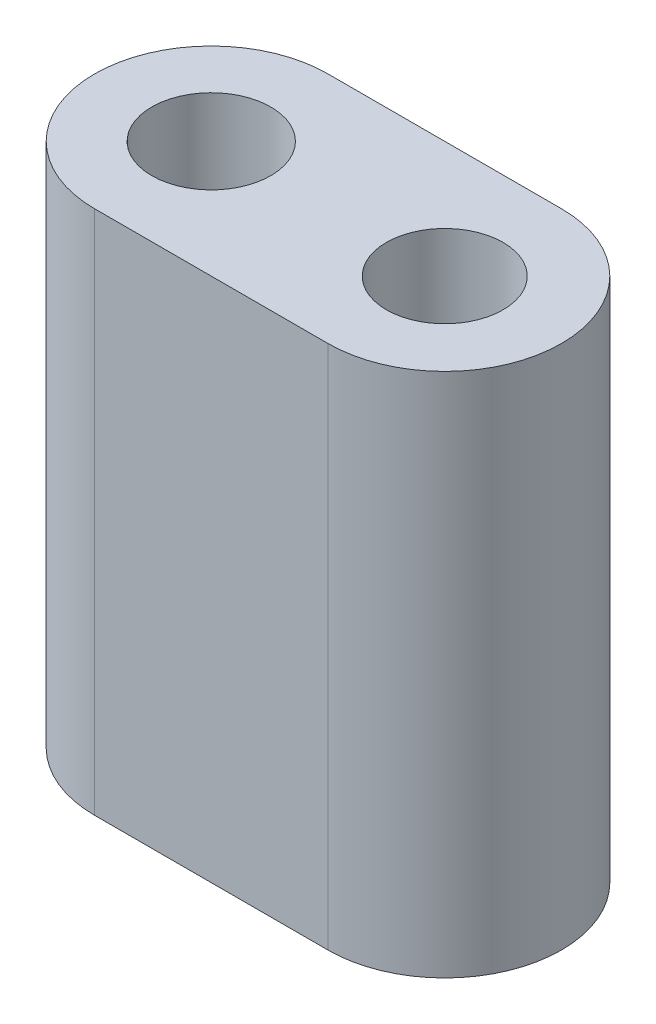
ISO-10303-21;
HEADER;
FILE_DESCRIPTION(('STEP AP214'),'2;1');
FILE_NAME('part.step','',(''),(''),'','','');
FILE_SCHEMA(('AUTOMOTIVE_DESIGN { 1 0 10303 214 1 1 1 1 }'));
ENDSEC;
DATA;
#1=APPLICATION_CONTEXT('core data for automotive mechanical design processes');
#2=APPLICATION_PROTOCOL_DEFINITION('international standard','automotive_design',2000,#1);
#3=PRODUCT_CONTEXT('',#1,'mechanical');
#4=PRODUCT('Part','Part','',(#3));
#5=PRODUCT_RELATED_PRODUCT_CATEGORY('part','',(#4));
#6=PRODUCT_DEFINITION_FORMATION('','',#4);
#7=PRODUCT_DEFINITION_CONTEXT('part definition',#1,'design');
#8=PRODUCT_DEFINITION('design','',#6,#7);
#9=PRODUCT_DEFINITION_SHAPE('','',#8);
#10=(LENGTH_UNIT() NAMED_UNIT(*) SI_UNIT(.MILLI.,.METRE.));
#11=(NAMED_UNIT(*) PLANE_ANGLE_UNIT() SI_UNIT($,.RADIAN.));
#12=(NAMED_UNIT(*) SI_UNIT($,.STERADIAN.) SOLID_ANGLE_UNIT());
#13=UNCERTAINTY_MEASURE_WITH_UNIT(LENGTH_MEASURE(1.E-05),#10,'distance_accuracy_value','');
#14=(GEOMETRIC_REPRESENTATION_CONTEXT(3) GLOBAL_UNCERTAINTY_ASSIGNED_CONTEXT((#13)) GLOBAL_UNIT_ASSIGNED_CONTEXT((#10,
#11,#12)) REPRESENTATION_CONTEXT('',''));
#15=CARTESIAN_POINT('',(0.,0.,0.));
#16=DIRECTION('',(0.,0.,1.));
#17=DIRECTION('',(1.,0.,0.));
#18=AXIS2_PLACEMENT_3D('',#15,#16,#17);
#19=CARTESIAN_POINT('',(12.7,28.575,0.));
#20=DIRECTION('',(0.,-1.,0.));
#21=DIRECTION('',(0.,0.,-1.));
#22=AXIS2_PLACEMENT_3D('',#19,#20,#21);
#23=CYLINDRICAL_SURFACE('',#22,3.175);
#24=CARTESIAN_POINT('',(12.7,28.575,0.));
#25=DIRECTION('',(0.,1.,0.));
#26=DIRECTION('',(0.,0.,1.));
#27=AXIS2_PLACEMENT_3D('',#24,#25,#26);
#28=CIRCLE('',#27,3.175);
#29=CARTESIAN_POINT('',(12.7,28.575,3.175));
#30=VERTEX_POINT('',#29);
#31=EDGE_CURVE('E116',#30,#30,#28,.T.);
#32=ORIENTED_EDGE('',*,*,#31,.T.);
#33=EDGE_LOOP('',(#32));
#34=FACE_BOUND('',#33,.T.);
#35=CARTESIAN_POINT('',(12.7,3.175,0.));
#36=DIRECTION('',(0.,-1.,0.));
#37=DIRECTION('',(0.,0.,-1.));
#38=AXIS2_PLACEMENT_3D('',#35,#36,#37);
#39=CIRCLE('',#38,3.175);
#40=CARTESIAN_POINT('',(12.7,3.175,-3.175));
#41=VERTEX_POINT('',#40);
#42=EDGE_CURVE('E121',#41,#41,#39,.T.);
#43=ORIENTED_EDGE('',*,*,#42,.T.);
#44=EDGE_LOOP('',(#43));
#45=FACE_BOUND('',#44,.T.);
#46=ADVANCED_FACE('F33',(#34,#45),#23,.F.);
#47=CARTESIAN_POINT('',(0.,28.575,0.));
#48=DIRECTION('',(0.,1.,0.));
#49=DIRECTION('',(0.,0.,1.));
#50=AXIS2_PLACEMENT_3D('',#47,#48,#49);
#51=PLANE('',#50);
#52=CARTESIAN_POINT('',(0.,28.575,0.));
#53=DIRECTION('',(0.,1.,0.));
#54=DIRECTION('',(0.,0.,1.));
#55=AXIS2_PLACEMENT_3D('',#52,#53,#54);
#56=CIRCLE('',#55,3.2385);
#57=CARTESIAN_POINT('',(0.,28.575,3.2385));
#58=VERTEX_POINT('',#57);
#59=EDGE_CURVE('E101',#58,#58,#56,.T.);
#60=ORIENTED_EDGE('',*,*,#59,.F.);
#61=EDGE_LOOP('',(#60));
#62=FACE_BOUND('',#61,.T.);
#63=CARTESIAN_POINT('',(0.,28.575,0.));
#64=DIRECTION('',(0.,1.,0.));
#65=DIRECTION('',(0.,0.,1.));
#66=AXIS2_PLACEMENT_3D('',#63,#64,#65);
#67=CIRCLE('',#66,6.35);
#68=CARTESIAN_POINT('',(0.,28.575,-6.35));
#69=VERTEX_POINT('',#68);
#70=CARTESIAN_POINT('',(0.,28.575,6.35));
#71=VERTEX_POINT('',#70);
#72=EDGE_CURVE('E86',#69,#71,#67,.T.);
#73=ORIENTED_EDGE('',*,*,#72,.T.);
#74=DIRECTION('',(1.,0.,0.));
#75=VECTOR('',#74,1.);
#76=CARTESIAN_POINT('',(0.,28.575,6.35));
#77=LINE('',#76,#75);
#78=CARTESIAN_POINT('',(12.7,28.575,6.35));
#79=VERTEX_POINT('',#78);
#80=EDGE_CURVE('E80',#71,#79,#77,.T.);
#81=ORIENTED_EDGE('',*,*,#80,.T.);
#82=CARTESIAN_POINT('',(12.7,28.575,0.));
#83=DIRECTION('',(0.,1.,0.));
#84=DIRECTION('',(0.,0.,1.));
#85=AXIS2_PLACEMENT_3D('',#82,#83,#84);
#86=CIRCLE('',#85,6.35);
#87=CARTESIAN_POINT('',(12.7,28.575,-6.35));
#88=VERTEX_POINT('',#87);
#89=EDGE_CURVE('E84',#79,#88,#86,.T.);
#90=ORIENTED_EDGE('',*,*,#89,.T.);
#91=DIRECTION('',(-1.,0.,0.));
#92=VECTOR('',#91,1.);
#93=CARTESIAN_POINT('',(0.,28.575,-6.35));
#94=LINE('',#93,#92);
#95=EDGE_CURVE('E50',#88,#69,#94,.T.);
#96=ORIENTED_EDGE('',*,*,#95,.T.);
#97=EDGE_LOOP('',(#73,#81,#90,#96));
#98=FACE_BOUND('',#97,.T.);
#99=ORIENTED_EDGE('',*,*,#31,.F.);
#100=EDGE_LOOP('',(#99));
#101=FACE_BOUND('',#100,.T.);
#102=ADVANCED_FACE('F81',(#62,#98,#101),#51,.T.);
#103=CARTESIAN_POINT('',(0.,0.,0.));
#104=DIRECTION('',(0.,1.,0.));
#105=DIRECTION('',(0.,0.,1.));
#106=AXIS2_PLACEMENT_3D('',#103,#104,#105);
#107=PLANE('',#106);
#108=CARTESIAN_POINT('',(0.,0.,0.));
#109=DIRECTION('',(0.,1.,0.));
#110=DIRECTION('',(0.,0.,1.));
#111=AXIS2_PLACEMENT_3D('',#108,#109,#110);
#112=CIRCLE('',#111,3.2385);
#113=CARTESIAN_POINT('',(0.,0.,3.2385));
#114=VERTEX_POINT('',#113);
#115=EDGE_CURVE('E113',#114,#114,#112,.T.);
#116=ORIENTED_EDGE('',*,*,#115,.T.);
#117=EDGE_LOOP('',(#116));
#118=FACE_BOUND('',#117,.T.);
#119=CARTESIAN_POINT('',(0.,0.,0.));
#120=DIRECTION('',(0.,1.,0.));
#121=DIRECTION('',(0.,0.,1.));
#122=AXIS2_PLACEMENT_3D('',#119,#120,#121);
#123=CIRCLE('',#122,6.35);
#124=CARTESIAN_POINT('',(0.,0.,-6.35));
#125=VERTEX_POINT('',#124);
#126=CARTESIAN_POINT('',(0.,0.,6.35));
#127=VERTEX_POINT('',#126);
#128=EDGE_CURVE('E98',#125,#127,#123,.T.);
#129=ORIENTED_EDGE('',*,*,#128,.F.);
#130=DIRECTION('',(-1.,0.,0.));
#131=VECTOR('',#130,1.);
#132=CARTESIAN_POINT('',(0.,0.,-6.35));
#133=LINE('',#132,#131);
#134=CARTESIAN_POINT('',(12.7,0.,-6.35));
#135=VERTEX_POINT('',#134);
#136=EDGE_CURVE('E73',#135,#125,#133,.T.);
#137=ORIENTED_EDGE('',*,*,#136,.F.);
#138=CARTESIAN_POINT('',(12.7,0.,0.));
#139=DIRECTION('',(0.,1.,0.));
#140=DIRECTION('',(0.,0.,1.));
#141=AXIS2_PLACEMENT_3D('',#138,#139,#140);
#142=CIRCLE('',#141,6.35);
#143=CARTESIAN_POINT('',(12.7,0.,6.35));
#144=VERTEX_POINT('',#143);
#145=EDGE_CURVE('E67',#144,#135,#142,.T.);
#146=ORIENTED_EDGE('',*,*,#145,.F.);
#147=DIRECTION('',(1.,0.,0.));
#148=VECTOR('',#147,1.);
#149=CARTESIAN_POINT('',(0.,0.,6.35));
#150=LINE('',#149,#148);
#151=EDGE_CURVE('E90',#127,#144,#150,.T.);
#152=ORIENTED_EDGE('',*,*,#151,.F.);
#153=EDGE_LOOP('',(#129,#137,#146,#152));
#154=FACE_BOUND('',#153,.T.);
#155=CARTESIAN_POINT('',(12.7,0.,0.));
#156=DIRECTION('',(0.,-1.,0.));
#157=DIRECTION('',(0.,0.,-1.));
#158=AXIS2_PLACEMENT_3D('',#155,#156,#157);
#159=CIRCLE('',#158,2.38125);
#160=CARTESIAN_POINT('',(12.7,0.,-2.38125));
#161=VERTEX_POINT('',#160);
#162=EDGE_CURVE('E125',#161,#161,#159,.T.);
#163=ORIENTED_EDGE('',*,*,#162,.F.);
#164=EDGE_LOOP('',(#163));
#165=FACE_BOUND('',#164,.T.);
#166=ADVANCED_FACE('F109',(#118,#154,#165),#107,.F.);
#167=CARTESIAN_POINT('',(0.,28.575,0.));
#168=DIRECTION('',(0.,-1.,0.));
#169=DIRECTION('',(0.,0.,-1.));
#170=AXIS2_PLACEMENT_3D('',#167,#168,#169);
#171=CYLINDRICAL_SURFACE('',#170,6.35);
#172=ORIENTED_EDGE('',*,*,#128,.T.);
#173=DIRECTION('',(0.,-1.,0.));
#174=VECTOR('',#173,1.);
#175=CARTESIAN_POINT('',(0.,28.575,6.35));
#176=LINE('',#175,#174);
#177=EDGE_CURVE('E11',#71,#127,#176,.T.);
#178=ORIENTED_EDGE('',*,*,#177,.F.);
#179=ORIENTED_EDGE('',*,*,#72,.F.);
#180=DIRECTION('',(0.,-1.,0.));
#181=VECTOR('',#180,1.);
#182=CARTESIAN_POINT('',(0.,28.575,-6.35));
#183=LINE('',#182,#181);
#184=EDGE_CURVE('E94',#69,#125,#183,.T.);
#185=ORIENTED_EDGE('',*,*,#184,.T.);
#186=EDGE_LOOP('',(#172,#178,#179,#185));
#187=FACE_BOUND('',#186,.T.);
#188=ADVANCED_FACE('F35',(#187),#171,.T.);
#189=CARTESIAN_POINT('',(0.,28.575,6.35));
#190=DIRECTION('',(0.,0.,-1.));
#191=DIRECTION('',(-1.,0.,0.));
#192=AXIS2_PLACEMENT_3D('',#189,#190,#191);
#193=PLANE('',#192);
#194=ORIENTED_EDGE('',*,*,#151,.T.);
#195=DIRECTION('',(0.,-1.,0.));
#196=VECTOR('',#195,1.);
#197=CARTESIAN_POINT('',(12.7,28.575,6.35));
#198=LINE('',#197,#196);
#199=EDGE_CURVE('E42',#79,#144,#198,.T.);
#200=ORIENTED_EDGE('',*,*,#199,.F.);
#201=ORIENTED_EDGE('',*,*,#80,.F.);
#202=ORIENTED_EDGE('',*,*,#177,.T.);
#203=EDGE_LOOP('',(#194,#200,#201,#202));
#204=FACE_BOUND('',#203,.T.);
#205=ADVANCED_FACE('F89',(#204),#193,.F.);
#206=CARTESIAN_POINT('',(12.7,28.575,0.));
#207=DIRECTION('',(0.,-1.,0.));
#208=DIRECTION('',(0.,0.,-1.));
#209=AXIS2_PLACEMENT_3D('',#206,#207,#208);
#210=CYLINDRICAL_SURFACE('',#209,6.35);
#211=ORIENTED_EDGE('',*,*,#145,.T.);
#212=DIRECTION('',(0.,-1.,0.));
#213=VECTOR('',#212,1.);
#214=CARTESIAN_POINT('',(12.7,28.575,-6.35));
#215=LINE('',#214,#213);
#216=EDGE_CURVE('E91',#88,#135,#215,.T.);
#217=ORIENTED_EDGE('',*,*,#216,.F.);
#218=ORIENTED_EDGE('',*,*,#89,.F.);
#219=ORIENTED_EDGE('',*,*,#199,.T.);
#220=EDGE_LOOP('',(#211,#217,#218,#219));
#221=FACE_BOUND('',#220,.T.);
#222=ADVANCED_FACE('F92',(#221),#210,.T.);
#223=CARTESIAN_POINT('',(0.,28.575,-6.35));
#224=DIRECTION('',(0.,0.,1.));
#225=DIRECTION('',(1.,0.,0.));
#226=AXIS2_PLACEMENT_3D('',#223,#224,#225);
#227=PLANE('',#226);
#228=ORIENTED_EDGE('',*,*,#136,.T.);
#229=ORIENTED_EDGE('',*,*,#184,.F.);
#230=ORIENTED_EDGE('',*,*,#95,.F.);
#231=ORIENTED_EDGE('',*,*,#216,.T.);
#232=EDGE_LOOP('',(#228,#229,#230,#231));
#233=FACE_BOUND('',#232,.T.);
#234=ADVANCED_FACE('F106',(#233),#227,.F.);
#235=CARTESIAN_POINT('',(0.,28.575,0.));
#236=DIRECTION('',(0.,-1.,0.));
#237=DIRECTION('',(0.,0.,-1.));
#238=AXIS2_PLACEMENT_3D('',#235,#236,#237);
#239=CYLINDRICAL_SURFACE('',#238,3.2385);
#240=ORIENTED_EDGE('',*,*,#59,.T.);
#241=EDGE_LOOP('',(#240));
#242=FACE_BOUND('',#241,.T.);
#243=ORIENTED_EDGE('',*,*,#115,.F.);
#244=EDGE_LOOP('',(#243));
#245=FACE_BOUND('',#244,.T.);
#246=ADVANCED_FACE('F157',(#242,#245),#239,.F.);
#247=CARTESIAN_POINT('',(12.7,3.175,0.));
#248=DIRECTION('',(0.,-1.,0.));
#249=DIRECTION('',(0.,0.,-1.));
#250=AXIS2_PLACEMENT_3D('',#247,#248,#249);
#251=PLANE('',#250);
#252=CARTESIAN_POINT('',(12.7,3.175,0.));
#253=DIRECTION('',(0.,-1.,0.));
#254=DIRECTION('',(0.,0.,-1.));
#255=AXIS2_PLACEMENT_3D('',#252,#253,#254);
#256=CIRCLE('',#255,2.38125);
#257=CARTESIAN_POINT('',(12.7,3.175,-2.38125));
#258=VERTEX_POINT('',#257);
#259=EDGE_CURVE('E124',#258,#258,#256,.T.);
#260=ORIENTED_EDGE('',*,*,#259,.T.);
#261=EDGE_LOOP('',(#260));
#262=FACE_BOUND('',#261,.T.);
#263=ORIENTED_EDGE('',*,*,#42,.F.);
#264=EDGE_LOOP('',(#263));
#265=FACE_BOUND('',#264,.T.);
#266=ADVANCED_FACE('F131',(#262,#265),#251,.F.);
#267=CARTESIAN_POINT('',(12.7,3.175,0.));
#268=DIRECTION('',(0.,-1.,0.));
#269=DIRECTION('',(0.,0.,-1.));
#270=AXIS2_PLACEMENT_3D('',#267,#268,#269);
#271=CYLINDRICAL_SURFACE('',#270,2.38125);
#272=ORIENTED_EDGE('',*,*,#259,.F.);
#273=EDGE_LOOP('',(#272));
#274=FACE_BOUND('',#273,.T.);
#275=ORIENTED_EDGE('',*,*,#162,.T.);
#276=EDGE_LOOP('',(#275));
#277=FACE_BOUND('',#276,.T.);
#278=ADVANCED_FACE('F134',(#274,#277),#271,.F.);
#279=CLOSED_SHELL('',(#46,#102,#166,#188,#205,#222,#234,#246,#266,#278));
#280=MANIFOLD_SOLID_BREP('B2',#279);
#281=ADVANCED_BREP_SHAPE_REPRESENTATION('',(#18,#280),#14);
#282=SHAPE_DEFINITION_REPRESENTATION(#9,#281);
ENDSEC;
END-ISO-10303-21;
